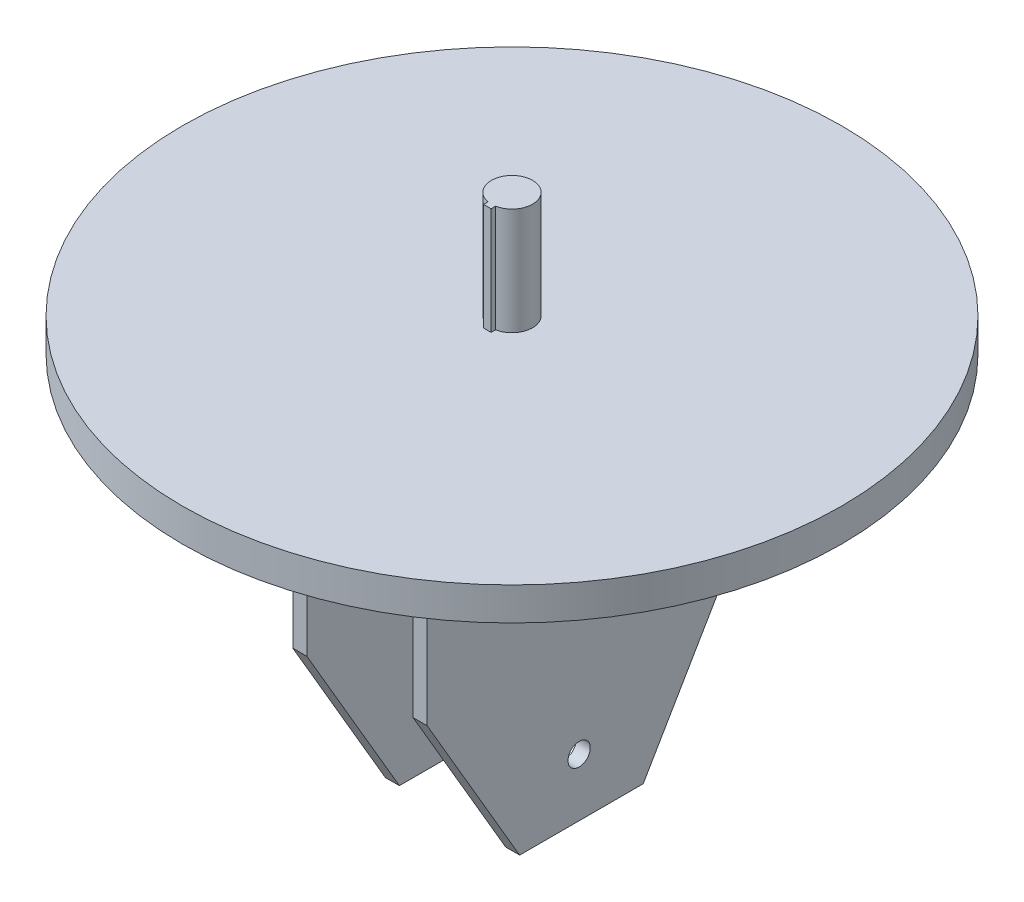
ISO-10303-21;
HEADER;
FILE_DESCRIPTION(('STEP AP214'),'2;1');
FILE_NAME('part.step','',(''),(''),'','','');
FILE_SCHEMA(('AUTOMOTIVE_DESIGN { 1 0 10303 214 1 1 1 1 }'));
ENDSEC;
DATA;
#1=APPLICATION_CONTEXT('core data for automotive mechanical design processes');
#2=APPLICATION_PROTOCOL_DEFINITION('international standard','automotive_design',2000,#1);
#3=PRODUCT_CONTEXT('',#1,'mechanical');
#4=PRODUCT('Part','Part','',(#3));
#5=PRODUCT_RELATED_PRODUCT_CATEGORY('part','',(#4));
#6=PRODUCT_DEFINITION_FORMATION('','',#4);
#7=PRODUCT_DEFINITION_CONTEXT('part definition',#1,'design');
#8=PRODUCT_DEFINITION('design','',#6,#7);
#9=PRODUCT_DEFINITION_SHAPE('','',#8);
#10=(LENGTH_UNIT() NAMED_UNIT(*) SI_UNIT(.MILLI.,.METRE.));
#11=(NAMED_UNIT(*) PLANE_ANGLE_UNIT() SI_UNIT($,.RADIAN.));
#12=(NAMED_UNIT(*) SI_UNIT($,.STERADIAN.) SOLID_ANGLE_UNIT());
#13=UNCERTAINTY_MEASURE_WITH_UNIT(LENGTH_MEASURE(1.E-05),#10,'distance_accuracy_value','');
#14=(GEOMETRIC_REPRESENTATION_CONTEXT(3) GLOBAL_UNCERTAINTY_ASSIGNED_CONTEXT((#13)) GLOBAL_UNIT_ASSIGNED_CONTEXT((#10,
#11,#12)) REPRESENTATION_CONTEXT('',''));
#15=CARTESIAN_POINT('',(0.,0.,0.));
#16=DIRECTION('',(0.,0.,1.));
#17=DIRECTION('',(1.,0.,0.));
#18=AXIS2_PLACEMENT_3D('',#15,#16,#17);
#19=CARTESIAN_POINT('',(81.5,-480.,184.555898069512));
#20=DIRECTION('',(-1.,0.,0.));
#21=DIRECTION('',(0.,0.,1.));
#22=AXIS2_PLACEMENT_3D('',#19,#20,#21);
#23=PLANE('',#22);
#24=CARTESIAN_POINT('',(81.5,-410.,0.));
#25=DIRECTION('',(-1.,0.,0.));
#26=DIRECTION('',(0.,0.,1.));
#27=AXIS2_PLACEMENT_3D('',#24,#25,#26);
#28=CIRCLE('',#27,13.5);
#29=CARTESIAN_POINT('',(81.5,-410.,13.5));
#30=VERTEX_POINT('',#29);
#31=EDGE_CURVE('E167',#30,#30,#28,.T.);
#32=ORIENTED_EDGE('',*,*,#31,.T.);
#33=EDGE_LOOP('',(#32));
#34=FACE_BOUND('',#33,.T.);
#35=DIRECTION('',(0.,0.863366102547364,0.504578014753096));
#36=VECTOR('',#35,1.);
#37=CARTESIAN_POINT('',(81.5,-431.058584485257,100.813923725285));
#38=LINE('',#37,#36);
#39=CARTESIAN_POINT('',(81.5,-480.,72.2110376416492));
#40=VERTEX_POINT('',#39);
#41=CARTESIAN_POINT('',(81.5,-287.770569757595,184.555898069512));
#42=VERTEX_POINT('',#41);
#43=EDGE_CURVE('E315',#40,#42,#38,.T.);
#44=ORIENTED_EDGE('',*,*,#43,.F.);
#45=DIRECTION('',(0.,0.,1.));
#46=VECTOR('',#45,1.);
#47=CARTESIAN_POINT('',(81.5,-480.,184.555898069512));
#48=LINE('',#47,#46);
#49=CARTESIAN_POINT('',(81.5,-480.,-77.7889623583508));
#50=VERTEX_POINT('',#49);
#51=EDGE_CURVE('E176',#50,#40,#48,.T.);
#52=ORIENTED_EDGE('',*,*,#51,.F.);
#53=DIRECTION('',(0.,-0.863366102547364,0.504578014753096));
#54=VECTOR('',#53,1.);
#55=CARTESIAN_POINT('',(81.5,-594.286748619013,-10.9962303288882));
#56=LINE('',#55,#54);
#57=CARTESIAN_POINT('',(81.5,-287.770569757595,-190.133822786214));
#58=VERTEX_POINT('',#57);
#59=EDGE_CURVE('E70',#58,#50,#56,.T.);
#60=ORIENTED_EDGE('',*,*,#59,.F.);
#61=DIRECTION('',(0.,1.,0.));
#62=VECTOR('',#61,1.);
#63=CARTESIAN_POINT('',(81.5,-480.,-190.133822786213));
#64=LINE('',#63,#62);
#65=CARTESIAN_POINT('',(81.5,-30.,-190.133822786213));
#66=VERTEX_POINT('',#65);
#67=EDGE_CURVE('E173',#58,#66,#64,.T.);
#68=ORIENTED_EDGE('',*,*,#67,.T.);
#69=DIRECTION('',(0.,0.,1.));
#70=VECTOR('',#69,1.);
#71=CARTESIAN_POINT('',(81.5,-30.,184.555898069512));
#72=LINE('',#71,#70);
#73=CARTESIAN_POINT('',(81.5,-30.,184.555898069512));
#74=VERTEX_POINT('',#73);
#75=EDGE_CURVE('E206',#66,#74,#72,.T.);
#76=ORIENTED_EDGE('',*,*,#75,.T.);
#77=DIRECTION('',(0.,1.,0.));
#78=VECTOR('',#77,1.);
#79=CARTESIAN_POINT('',(81.5,-480.,184.555898069512));
#80=LINE('',#79,#78);
#81=EDGE_CURVE('E313',#42,#74,#80,.T.);
#82=ORIENTED_EDGE('',*,*,#81,.F.);
#83=EDGE_LOOP('',(#44,#52,#60,#68,#76,#82));
#84=FACE_BOUND('',#83,.T.);
#85=ADVANCED_FACE('F45',(#34,#84),#23,.F.);
#86=CARTESIAN_POINT('',(81.5,-480.,184.555898069512));
#87=DIRECTION('',(0.,0.,-1.));
#88=DIRECTION('',(-1.,0.,0.));
#89=AXIS2_PLACEMENT_3D('',#86,#87,#88);
#90=PLANE('',#89);
#91=DIRECTION('',(-1.,0.,0.));
#92=VECTOR('',#91,1.);
#93=CARTESIAN_POINT('',(400.,-287.770569757595,184.555898069512));
#94=LINE('',#93,#92);
#95=CARTESIAN_POINT('',(64.5,-287.770569757595,184.555898069512));
#96=VERTEX_POINT('',#95);
#97=EDGE_CURVE('E330',#42,#96,#94,.T.);
#98=ORIENTED_EDGE('',*,*,#97,.F.);
#99=ORIENTED_EDGE('',*,*,#81,.T.);
#100=DIRECTION('',(-1.,0.,0.));
#101=VECTOR('',#100,1.);
#102=CARTESIAN_POINT('',(81.5,-30.,184.555898069512));
#103=LINE('',#102,#101);
#104=CARTESIAN_POINT('',(64.5,-30.,184.555898069512));
#105=VERTEX_POINT('',#104);
#106=EDGE_CURVE('E202',#74,#105,#103,.T.);
#107=ORIENTED_EDGE('',*,*,#106,.T.);
#108=DIRECTION('',(0.,1.,0.));
#109=VECTOR('',#108,1.);
#110=CARTESIAN_POINT('',(64.5,-480.,184.555898069512));
#111=LINE('',#110,#109);
#112=EDGE_CURVE('E192',#96,#105,#111,.T.);
#113=ORIENTED_EDGE('',*,*,#112,.F.);
#114=EDGE_LOOP('',(#98,#99,#107,#113));
#115=FACE_BOUND('',#114,.T.);
#116=ADVANCED_FACE('F328',(#115),#90,.F.);
#117=CARTESIAN_POINT('',(64.5,-480.,184.555898069512));
#118=DIRECTION('',(1.,0.,0.));
#119=DIRECTION('',(0.,0.,-1.));
#120=AXIS2_PLACEMENT_3D('',#117,#118,#119);
#121=PLANE('',#120);
#122=CARTESIAN_POINT('',(64.5,-410.,0.));
#123=DIRECTION('',(1.,0.,0.));
#124=DIRECTION('',(0.,0.,-1.));
#125=AXIS2_PLACEMENT_3D('',#122,#123,#124);
#126=CIRCLE('',#125,13.5);
#127=CARTESIAN_POINT('',(64.5,-410.,-13.5));
#128=VERTEX_POINT('',#127);
#129=EDGE_CURVE('E364',#128,#128,#126,.T.);
#130=ORIENTED_EDGE('',*,*,#129,.T.);
#131=EDGE_LOOP('',(#130));
#132=FACE_BOUND('',#131,.T.);
#133=DIRECTION('',(0.,-0.863366102547364,-0.504578014753096));
#134=VECTOR('',#133,1.);
#135=CARTESIAN_POINT('',(64.5,-431.058584485257,100.813923725285));
#136=LINE('',#135,#134);
#137=CARTESIAN_POINT('',(64.5,-480.,72.2110376416492));
#138=VERTEX_POINT('',#137);
#139=EDGE_CURVE('E62',#96,#138,#136,.T.);
#140=ORIENTED_EDGE('',*,*,#139,.F.);
#141=ORIENTED_EDGE('',*,*,#112,.T.);
#142=DIRECTION('',(0.,0.,-1.));
#143=VECTOR('',#142,1.);
#144=CARTESIAN_POINT('',(64.5,-30.,184.555898069512));
#145=LINE('',#144,#143);
#146=CARTESIAN_POINT('',(64.5,-30.,-190.133822786213));
#147=VERTEX_POINT('',#146);
#148=EDGE_CURVE('E198',#105,#147,#145,.T.);
#149=ORIENTED_EDGE('',*,*,#148,.T.);
#150=DIRECTION('',(0.,1.,0.));
#151=VECTOR('',#150,1.);
#152=CARTESIAN_POINT('',(64.5,-480.,-190.133822786213));
#153=LINE('',#152,#151);
#154=CARTESIAN_POINT('',(64.5000000000001,-287.770569757595,-190.133822786214));
#155=VERTEX_POINT('',#154);
#156=EDGE_CURVE('E186',#155,#147,#153,.T.);
#157=ORIENTED_EDGE('',*,*,#156,.F.);
#158=DIRECTION('',(0.,0.863366102547364,-0.504578014753096));
#159=VECTOR('',#158,1.);
#160=CARTESIAN_POINT('',(64.5,-594.286748619013,-10.9962303288882));
#161=LINE('',#160,#159);
#162=CARTESIAN_POINT('',(64.5,-480.,-77.7889623583508));
#163=VERTEX_POINT('',#162);
#164=EDGE_CURVE('E161',#163,#155,#161,.T.);
#165=ORIENTED_EDGE('',*,*,#164,.F.);
#166=DIRECTION('',(0.,0.,-1.));
#167=VECTOR('',#166,1.);
#168=CARTESIAN_POINT('',(64.5,-480.,184.555898069512));
#169=LINE('',#168,#167);
#170=EDGE_CURVE('E185',#138,#163,#169,.T.);
#171=ORIENTED_EDGE('',*,*,#170,.F.);
#172=EDGE_LOOP('',(#140,#141,#149,#157,#165,#171));
#173=FACE_BOUND('',#172,.T.);
#174=ADVANCED_FACE('F320',(#132,#173),#121,.F.);
#175=CARTESIAN_POINT('',(81.5,-480.,-190.133822786213));
#176=DIRECTION('',(0.,0.,1.));
#177=DIRECTION('',(1.,0.,0.));
#178=AXIS2_PLACEMENT_3D('',#175,#176,#177);
#179=PLANE('',#178);
#180=DIRECTION('',(-1.,0.,0.));
#181=VECTOR('',#180,1.);
#182=CARTESIAN_POINT('',(400.,-287.770569757595,-190.133822786214));
#183=LINE('',#182,#181);
#184=EDGE_CURVE('E158',#58,#155,#183,.T.);
#185=ORIENTED_EDGE('',*,*,#184,.T.);
#186=ORIENTED_EDGE('',*,*,#156,.T.);
#187=DIRECTION('',(1.,0.,0.));
#188=VECTOR('',#187,1.);
#189=CARTESIAN_POINT('',(81.5,-30.,-190.133822786213));
#190=LINE('',#189,#188);
#191=EDGE_CURVE('E183',#147,#66,#190,.T.);
#192=ORIENTED_EDGE('',*,*,#191,.T.);
#193=ORIENTED_EDGE('',*,*,#67,.F.);
#194=EDGE_LOOP('',(#185,#186,#192,#193));
#195=FACE_BOUND('',#194,.T.);
#196=ADVANCED_FACE('F181',(#195),#179,.F.);
#197=CARTESIAN_POINT('',(0.,-480.,0.));
#198=DIRECTION('',(0.,1.,0.));
#199=DIRECTION('',(0.,0.,1.));
#200=AXIS2_PLACEMENT_3D('',#197,#198,#199);
#201=PLANE('',#200);
#202=DIRECTION('',(-1.,0.,0.));
#203=VECTOR('',#202,1.);
#204=CARTESIAN_POINT('',(400.,-480.,72.2110376416492));
#205=LINE('',#204,#203);
#206=EDGE_CURVE('E334',#40,#138,#205,.T.);
#207=ORIENTED_EDGE('',*,*,#206,.T.);
#208=ORIENTED_EDGE('',*,*,#170,.T.);
#209=DIRECTION('',(-1.,0.,0.));
#210=VECTOR('',#209,1.);
#211=CARTESIAN_POINT('',(400.,-480.,-77.7889623583508));
#212=LINE('',#211,#210);
#213=EDGE_CURVE('E166',#50,#163,#212,.T.);
#214=ORIENTED_EDGE('',*,*,#213,.F.);
#215=ORIENTED_EDGE('',*,*,#51,.T.);
#216=EDGE_LOOP('',(#207,#208,#214,#215));
#217=FACE_BOUND('',#216,.T.);
#218=ADVANCED_FACE('F333',(#217),#201,.F.);
#219=CARTESIAN_POINT('',(-81.5,-480.,184.555898069512));
#220=DIRECTION('',(1.,0.,0.));
#221=DIRECTION('',(0.,0.,-1.));
#222=AXIS2_PLACEMENT_3D('',#219,#220,#221);
#223=PLANE('',#222);
#224=CARTESIAN_POINT('',(-81.5,-410.,0.));
#225=DIRECTION('',(-1.,0.,0.));
#226=DIRECTION('',(0.,0.,1.));
#227=AXIS2_PLACEMENT_3D('',#224,#225,#226);
#228=CIRCLE('',#227,13.5);
#229=CARTESIAN_POINT('',(-81.5,-410.,13.5));
#230=VERTEX_POINT('',#229);
#231=EDGE_CURVE('E368',#230,#230,#228,.T.);
#232=ORIENTED_EDGE('',*,*,#231,.F.);
#233=EDGE_LOOP('',(#232));
#234=FACE_BOUND('',#233,.T.);
#235=DIRECTION('',(0.,-0.863366102547364,-0.504578014753096));
#236=VECTOR('',#235,1.);
#237=CARTESIAN_POINT('',(-81.5,-431.058584485257,100.813923725285));
#238=LINE('',#237,#236);
#239=CARTESIAN_POINT('',(-81.5,-287.770569757595,184.555898069512));
#240=VERTEX_POINT('',#239);
#241=CARTESIAN_POINT('',(-81.5,-480.,72.2110376416492));
#242=VERTEX_POINT('',#241);
#243=EDGE_CURVE('E354',#240,#242,#238,.T.);
#244=ORIENTED_EDGE('',*,*,#243,.F.);
#245=DIRECTION('',(0.,1.,0.));
#246=VECTOR('',#245,1.);
#247=CARTESIAN_POINT('',(-81.5,-480.,184.555898069512));
#248=LINE('',#247,#246);
#249=CARTESIAN_POINT('',(-81.5,-30.,184.555898069512));
#250=VERTEX_POINT('',#249);
#251=EDGE_CURVE('E282',#240,#250,#248,.T.);
#252=ORIENTED_EDGE('',*,*,#251,.T.);
#253=DIRECTION('',(0.,0.,-1.));
#254=VECTOR('',#253,1.);
#255=CARTESIAN_POINT('',(-81.5,-30.,184.555898069512));
#256=LINE('',#255,#254);
#257=CARTESIAN_POINT('',(-81.5,-30.,-184.646734823892));
#258=VERTEX_POINT('',#257);
#259=EDGE_CURVE('E208',#250,#258,#256,.T.);
#260=ORIENTED_EDGE('',*,*,#259,.T.);
#261=DIRECTION('',(0.,1.,0.));
#262=VECTOR('',#261,1.);
#263=CARTESIAN_POINT('',(-81.5,-480.,-184.646734823892));
#264=LINE('',#263,#262);
#265=CARTESIAN_POINT('',(-81.5,-297.159337420575,-184.646734823892));
#266=VERTEX_POINT('',#265);
#267=EDGE_CURVE('E217',#266,#258,#264,.T.);
#268=ORIENTED_EDGE('',*,*,#267,.F.);
#269=DIRECTION('',(0.,0.863366102547364,-0.504578014753096));
#270=VECTOR('',#269,1.);
#271=CARTESIAN_POINT('',(-81.5,-594.286748619013,-10.9962303288883));
#272=LINE('',#271,#270);
#273=CARTESIAN_POINT('',(-81.5,-480.,-77.7889623583509));
#274=VERTEX_POINT('',#273);
#275=EDGE_CURVE('E347',#274,#266,#272,.T.);
#276=ORIENTED_EDGE('',*,*,#275,.F.);
#277=DIRECTION('',(0.,0.,-1.));
#278=VECTOR('',#277,1.);
#279=CARTESIAN_POINT('',(-81.5,-480.,184.555898069512));
#280=LINE('',#279,#278);
#281=EDGE_CURVE('E271',#242,#274,#280,.T.);
#282=ORIENTED_EDGE('',*,*,#281,.F.);
#283=EDGE_LOOP('',(#244,#252,#260,#268,#276,#282));
#284=FACE_BOUND('',#283,.T.);
#285=ADVANCED_FACE('F400',(#234,#284),#223,.F.);
#286=CARTESIAN_POINT('',(-81.5,-480.,-184.646734823892));
#287=DIRECTION('',(0.,0.,1.));
#288=DIRECTION('',(1.,0.,0.));
#289=AXIS2_PLACEMENT_3D('',#286,#287,#288);
#290=PLANE('',#289);
#291=DIRECTION('',(1.,0.,0.));
#292=VECTOR('',#291,1.);
#293=CARTESIAN_POINT('',(-81.5,-297.159337420575,-184.646734823892));
#294=LINE('',#293,#292);
#295=CARTESIAN_POINT('',(-64.5,-297.159337420575,-184.646734823892));
#296=VERTEX_POINT('',#295);
#297=EDGE_CURVE('E344',#266,#296,#294,.T.);
#298=ORIENTED_EDGE('',*,*,#297,.F.);
#299=ORIENTED_EDGE('',*,*,#267,.T.);
#300=DIRECTION('',(1.,0.,0.));
#301=VECTOR('',#300,1.);
#302=CARTESIAN_POINT('',(-81.5,-30.,-184.646734823892));
#303=LINE('',#302,#301);
#304=CARTESIAN_POINT('',(-64.5,-30.,-184.646734823892));
#305=VERTEX_POINT('',#304);
#306=EDGE_CURVE('E295',#258,#305,#303,.T.);
#307=ORIENTED_EDGE('',*,*,#306,.T.);
#308=DIRECTION('',(0.,1.,0.));
#309=VECTOR('',#308,1.);
#310=CARTESIAN_POINT('',(-64.5,-480.,-184.646734823892));
#311=LINE('',#310,#309);
#312=EDGE_CURVE('E308',#296,#305,#311,.T.);
#313=ORIENTED_EDGE('',*,*,#312,.F.);
#314=EDGE_LOOP('',(#298,#299,#307,#313));
#315=FACE_BOUND('',#314,.T.);
#316=ADVANCED_FACE('F466',(#315),#290,.F.);
#317=CARTESIAN_POINT('',(-64.5,-480.,184.555898069512));
#318=DIRECTION('',(-1.,0.,0.));
#319=DIRECTION('',(0.,0.,1.));
#320=AXIS2_PLACEMENT_3D('',#317,#318,#319);
#321=PLANE('',#320);
#322=CARTESIAN_POINT('',(-64.5000000000001,-410.,0.));
#323=DIRECTION('',(-1.,0.,0.));
#324=DIRECTION('',(0.,0.,1.));
#325=AXIS2_PLACEMENT_3D('',#322,#323,#324);
#326=CIRCLE('',#325,13.5);
#327=CARTESIAN_POINT('',(-64.5000000000001,-410.,13.5));
#328=VERTEX_POINT('',#327);
#329=EDGE_CURVE('E49',#328,#328,#326,.T.);
#330=ORIENTED_EDGE('',*,*,#329,.T.);
#331=EDGE_LOOP('',(#330));
#332=FACE_BOUND('',#331,.T.);
#333=DIRECTION('',(0.,0.863366102547364,0.504578014753096));
#334=VECTOR('',#333,1.);
#335=CARTESIAN_POINT('',(-64.5,-431.058584485257,100.813923725285));
#336=LINE('',#335,#334);
#337=CARTESIAN_POINT('',(-64.5,-480.,72.2110376416492));
#338=VERTEX_POINT('',#337);
#339=CARTESIAN_POINT('',(-64.5,-287.770569757595,184.555898069512));
#340=VERTEX_POINT('',#339);
#341=EDGE_CURVE('E178',#338,#340,#336,.T.);
#342=ORIENTED_EDGE('',*,*,#341,.F.);
#343=DIRECTION('',(0.,0.,1.));
#344=VECTOR('',#343,1.);
#345=CARTESIAN_POINT('',(-64.5,-480.,184.555898069512));
#346=LINE('',#345,#344);
#347=CARTESIAN_POINT('',(-64.5,-480.,-77.7889623583508));
#348=VERTEX_POINT('',#347);
#349=EDGE_CURVE('E269',#348,#338,#346,.T.);
#350=ORIENTED_EDGE('',*,*,#349,.F.);
#351=DIRECTION('',(0.,-0.863366102547364,0.504578014753096));
#352=VECTOR('',#351,1.);
#353=CARTESIAN_POINT('',(-64.5,-594.286748619013,-10.9962303288883));
#354=LINE('',#353,#352);
#355=EDGE_CURVE('E278',#296,#348,#354,.T.);
#356=ORIENTED_EDGE('',*,*,#355,.F.);
#357=ORIENTED_EDGE('',*,*,#312,.T.);
#358=DIRECTION('',(0.,0.,1.));
#359=VECTOR('',#358,1.);
#360=CARTESIAN_POINT('',(-64.5,-30.,184.555898069512));
#361=LINE('',#360,#359);
#362=CARTESIAN_POINT('',(-64.5,-30.,184.555898069512));
#363=VERTEX_POINT('',#362);
#364=EDGE_CURVE('E299',#305,#363,#361,.T.);
#365=ORIENTED_EDGE('',*,*,#364,.T.);
#366=DIRECTION('',(0.,1.,0.));
#367=VECTOR('',#366,1.);
#368=CARTESIAN_POINT('',(-64.5,-480.,184.555898069512));
#369=LINE('',#368,#367);
#370=EDGE_CURVE('E286',#340,#363,#369,.T.);
#371=ORIENTED_EDGE('',*,*,#370,.F.);
#372=EDGE_LOOP('',(#342,#350,#356,#357,#365,#371));
#373=FACE_BOUND('',#372,.T.);
#374=ADVANCED_FACE('F277',(#332,#373),#321,.F.);
#375=CARTESIAN_POINT('',(-81.5,-480.,184.555898069512));
#376=DIRECTION('',(0.,0.,-1.));
#377=DIRECTION('',(-1.,0.,0.));
#378=AXIS2_PLACEMENT_3D('',#375,#376,#377);
#379=PLANE('',#378);
#380=EDGE_CURVE('E336',#340,#240,#94,.T.);
#381=ORIENTED_EDGE('',*,*,#380,.F.);
#382=ORIENTED_EDGE('',*,*,#370,.T.);
#383=DIRECTION('',(-1.,0.,0.));
#384=VECTOR('',#383,1.);
#385=CARTESIAN_POINT('',(-81.5,-30.,184.555898069512));
#386=LINE('',#385,#384);
#387=EDGE_CURVE('E288',#363,#250,#386,.T.);
#388=ORIENTED_EDGE('',*,*,#387,.T.);
#389=ORIENTED_EDGE('',*,*,#251,.F.);
#390=EDGE_LOOP('',(#381,#382,#388,#389));
#391=FACE_BOUND('',#390,.T.);
#392=ADVANCED_FACE('F463',(#391),#379,.F.);
#393=CARTESIAN_POINT('',(0.,-480.,0.));
#394=DIRECTION('',(0.,-1.,0.));
#395=DIRECTION('',(0.,0.,-1.));
#396=AXIS2_PLACEMENT_3D('',#393,#394,#395);
#397=PLANE('',#396);
#398=ORIENTED_EDGE('',*,*,#349,.T.);
#399=DIRECTION('',(-1.,0.,0.));
#400=VECTOR('',#399,1.);
#401=CARTESIAN_POINT('',(0.,-480.,72.2110376416492));
#402=LINE('',#401,#400);
#403=EDGE_CURVE('E11',#338,#242,#402,.T.);
#404=ORIENTED_EDGE('',*,*,#403,.T.);
#405=ORIENTED_EDGE('',*,*,#281,.T.);
#406=DIRECTION('',(1.,0.,0.));
#407=VECTOR('',#406,1.);
#408=CARTESIAN_POINT('',(0.,-480.,-77.7889623583509));
#409=LINE('',#408,#407);
#410=EDGE_CURVE('E55',#274,#348,#409,.T.);
#411=ORIENTED_EDGE('',*,*,#410,.T.);
#412=EDGE_LOOP('',(#398,#404,#405,#411));
#413=FACE_BOUND('',#412,.T.);
#414=ADVANCED_FACE('F268',(#413),#397,.T.);
#415=CARTESIAN_POINT('',(0.,-30.,0.));
#416=DIRECTION('',(0.,1.,0.));
#417=DIRECTION('',(0.,0.,1.));
#418=AXIS2_PLACEMENT_3D('',#415,#416,#417);
#419=PLANE('',#418);
#420=ORIENTED_EDGE('',*,*,#75,.F.);
#421=ORIENTED_EDGE('',*,*,#191,.F.);
#422=ORIENTED_EDGE('',*,*,#148,.F.);
#423=ORIENTED_EDGE('',*,*,#106,.F.);
#424=EDGE_LOOP('',(#420,#421,#422,#423));
#425=FACE_BOUND('',#424,.T.);
#426=CARTESIAN_POINT('',(0.,-30.,0.));
#427=DIRECTION('',(0.,1.,0.));
#428=DIRECTION('',(0.,0.,1.));
#429=AXIS2_PLACEMENT_3D('',#426,#427,#428);
#430=CIRCLE('',#429,400.);
#431=CARTESIAN_POINT('',(0.,-30.,400.));
#432=VERTEX_POINT('',#431);
#433=EDGE_CURVE('E212',#432,#432,#430,.T.);
#434=ORIENTED_EDGE('',*,*,#433,.F.);
#435=EDGE_LOOP('',(#434));
#436=FACE_BOUND('',#435,.T.);
#437=ORIENTED_EDGE('',*,*,#259,.F.);
#438=ORIENTED_EDGE('',*,*,#387,.F.);
#439=ORIENTED_EDGE('',*,*,#364,.F.);
#440=ORIENTED_EDGE('',*,*,#306,.F.);
#441=EDGE_LOOP('',(#437,#438,#439,#440));
#442=FACE_BOUND('',#441,.T.);
#443=ADVANCED_FACE('F326',(#425,#436,#442),#419,.F.);
#444=CARTESIAN_POINT('',(0.,10.,0.));
#445=DIRECTION('',(0.,1.,0.));
#446=DIRECTION('',(0.,0.,1.));
#447=AXIS2_PLACEMENT_3D('',#444,#445,#446);
#448=PLANE('',#447);
#449=CARTESIAN_POINT('',(0.,10.,0.));
#450=DIRECTION('',(0.,1.,0.));
#451=DIRECTION('',(0.,0.,1.));
#452=AXIS2_PLACEMENT_3D('',#449,#450,#451);
#453=CIRCLE('',#452,400.);
#454=CARTESIAN_POINT('',(0.,10.,400.));
#455=VERTEX_POINT('',#454);
#456=EDGE_CURVE('E258',#455,#455,#453,.T.);
#457=ORIENTED_EDGE('',*,*,#456,.T.);
#458=EDGE_LOOP('',(#457));
#459=FACE_BOUND('',#458,.T.);
#460=DIRECTION('',(0.,0.,1.));
#461=VECTOR('',#460,1.);
#462=CARTESIAN_POINT('',(-4.6,10.,30.015));
#463=LINE('',#462,#461);
#464=CARTESIAN_POINT('',(-4.6,10.,24.5731560854523));
#465=VERTEX_POINT('',#464);
#466=CARTESIAN_POINT('',(-4.6,10.,30.015));
#467=VERTEX_POINT('',#466);
#468=EDGE_CURVE('E236',#465,#467,#463,.T.);
#469=ORIENTED_EDGE('',*,*,#468,.F.);
#470=CARTESIAN_POINT('',(0.,10.,0.));
#471=DIRECTION('',(0.,1.,0.));
#472=DIRECTION('',(0.,0.,1.));
#473=AXIS2_PLACEMENT_3D('',#470,#471,#472);
#474=CIRCLE('',#473,25.);
#475=CARTESIAN_POINT('',(4.6,10.,24.5731560854523));
#476=VERTEX_POINT('',#475);
#477=EDGE_CURVE('E216',#476,#465,#474,.T.);
#478=ORIENTED_EDGE('',*,*,#477,.F.);
#479=DIRECTION('',(0.,0.,-1.));
#480=VECTOR('',#479,1.);
#481=CARTESIAN_POINT('',(4.6,10.,30.015));
#482=LINE('',#481,#480);
#483=CARTESIAN_POINT('',(4.6,10.,30.015));
#484=VERTEX_POINT('',#483);
#485=EDGE_CURVE('E223',#484,#476,#482,.T.);
#486=ORIENTED_EDGE('',*,*,#485,.F.);
#487=DIRECTION('',(1.,0.,0.));
#488=VECTOR('',#487,1.);
#489=CARTESIAN_POINT('',(-4.6,10.,30.015));
#490=LINE('',#489,#488);
#491=EDGE_CURVE('E239',#467,#484,#490,.T.);
#492=ORIENTED_EDGE('',*,*,#491,.F.);
#493=EDGE_LOOP('',(#469,#478,#486,#492));
#494=FACE_BOUND('',#493,.T.);
#495=ADVANCED_FACE('F411',(#459,#494),#448,.T.);
#496=CARTESIAN_POINT('',(0.,10.,0.));
#497=DIRECTION('',(0.,-1.,0.));
#498=DIRECTION('',(0.,0.,-1.));
#499=AXIS2_PLACEMENT_3D('',#496,#497,#498);
#500=CYLINDRICAL_SURFACE('',#499,400.);
#501=ORIENTED_EDGE('',*,*,#456,.F.);
#502=EDGE_LOOP('',(#501));
#503=FACE_BOUND('',#502,.T.);
#504=ORIENTED_EDGE('',*,*,#433,.T.);
#505=EDGE_LOOP('',(#504));
#506=FACE_BOUND('',#505,.T.);
#507=ADVANCED_FACE('F47',(#503,#506),#500,.T.);
#508=CARTESIAN_POINT('',(0.,140.,0.));
#509=DIRECTION('',(0.,-1.,0.));
#510=DIRECTION('',(0.,0.,-1.));
#511=AXIS2_PLACEMENT_3D('',#508,#509,#510);
#512=CYLINDRICAL_SURFACE('',#511,25.);
#513=ORIENTED_EDGE('',*,*,#477,.T.);
#514=DIRECTION('',(0.,-1.,0.));
#515=VECTOR('',#514,1.);
#516=CARTESIAN_POINT('',(-4.6,140.,24.5731560854523));
#517=LINE('',#516,#515);
#518=CARTESIAN_POINT('',(-4.6,140.,24.5731560854523));
#519=VERTEX_POINT('',#518);
#520=EDGE_CURVE('E255',#519,#465,#517,.T.);
#521=ORIENTED_EDGE('',*,*,#520,.F.);
#522=CARTESIAN_POINT('',(0.,140.,0.));
#523=DIRECTION('',(0.,1.,0.));
#524=DIRECTION('',(0.,0.,1.));
#525=AXIS2_PLACEMENT_3D('',#522,#523,#524);
#526=CIRCLE('',#525,25.);
#527=CARTESIAN_POINT('',(4.6,140.,24.5731560854523));
#528=VERTEX_POINT('',#527);
#529=EDGE_CURVE('E218',#528,#519,#526,.T.);
#530=ORIENTED_EDGE('',*,*,#529,.F.);
#531=DIRECTION('',(0.,-1.,0.));
#532=VECTOR('',#531,1.);
#533=CARTESIAN_POINT('',(4.6,140.,24.5731560854523));
#534=LINE('',#533,#532);
#535=EDGE_CURVE('E232',#528,#476,#534,.T.);
#536=ORIENTED_EDGE('',*,*,#535,.T.);
#537=EDGE_LOOP('',(#513,#521,#530,#536));
#538=FACE_BOUND('',#537,.T.);
#539=ADVANCED_FACE('F428',(#538),#512,.T.);
#540=CARTESIAN_POINT('',(-4.6,140.,30.015));
#541=DIRECTION('',(1.,0.,0.));
#542=DIRECTION('',(0.,0.,-1.));
#543=AXIS2_PLACEMENT_3D('',#540,#541,#542);
#544=PLANE('',#543);
#545=ORIENTED_EDGE('',*,*,#468,.T.);
#546=DIRECTION('',(0.,-1.,0.));
#547=VECTOR('',#546,1.);
#548=CARTESIAN_POINT('',(-4.6,140.,30.015));
#549=LINE('',#548,#547);
#550=CARTESIAN_POINT('',(-4.6,140.,30.015));
#551=VERTEX_POINT('',#550);
#552=EDGE_CURVE('E251',#551,#467,#549,.T.);
#553=ORIENTED_EDGE('',*,*,#552,.F.);
#554=DIRECTION('',(0.,0.,1.));
#555=VECTOR('',#554,1.);
#556=CARTESIAN_POINT('',(-4.6,140.,30.015));
#557=LINE('',#556,#555);
#558=EDGE_CURVE('E222',#519,#551,#557,.T.);
#559=ORIENTED_EDGE('',*,*,#558,.F.);
#560=ORIENTED_EDGE('',*,*,#520,.T.);
#561=EDGE_LOOP('',(#545,#553,#559,#560));
#562=FACE_BOUND('',#561,.T.);
#563=ADVANCED_FACE('F424',(#562),#544,.F.);
#564=CARTESIAN_POINT('',(-4.6,140.,30.015));
#565=DIRECTION('',(0.,0.,-1.));
#566=DIRECTION('',(-1.,0.,0.));
#567=AXIS2_PLACEMENT_3D('',#564,#565,#566);
#568=PLANE('',#567);
#569=ORIENTED_EDGE('',*,*,#491,.T.);
#570=DIRECTION('',(0.,-1.,0.));
#571=VECTOR('',#570,1.);
#572=CARTESIAN_POINT('',(4.6,140.,30.015));
#573=LINE('',#572,#571);
#574=CARTESIAN_POINT('',(4.6,140.,30.015));
#575=VERTEX_POINT('',#574);
#576=EDGE_CURVE('E248',#575,#484,#573,.T.);
#577=ORIENTED_EDGE('',*,*,#576,.F.);
#578=DIRECTION('',(1.,0.,0.));
#579=VECTOR('',#578,1.);
#580=CARTESIAN_POINT('',(-4.6,140.,30.015));
#581=LINE('',#580,#579);
#582=EDGE_CURVE('E226',#551,#575,#581,.T.);
#583=ORIENTED_EDGE('',*,*,#582,.F.);
#584=ORIENTED_EDGE('',*,*,#552,.T.);
#585=EDGE_LOOP('',(#569,#577,#583,#584));
#586=FACE_BOUND('',#585,.T.);
#587=ADVANCED_FACE('F420',(#586),#568,.F.);
#588=CARTESIAN_POINT('',(4.6,140.,30.015));
#589=DIRECTION('',(-1.,0.,0.));
#590=DIRECTION('',(0.,0.,1.));
#591=AXIS2_PLACEMENT_3D('',#588,#589,#590);
#592=PLANE('',#591);
#593=ORIENTED_EDGE('',*,*,#485,.T.);
#594=ORIENTED_EDGE('',*,*,#535,.F.);
#595=DIRECTION('',(0.,0.,-1.));
#596=VECTOR('',#595,1.);
#597=CARTESIAN_POINT('',(4.6,140.,30.015));
#598=LINE('',#597,#596);
#599=EDGE_CURVE('E229',#575,#528,#598,.T.);
#600=ORIENTED_EDGE('',*,*,#599,.F.);
#601=ORIENTED_EDGE('',*,*,#576,.T.);
#602=EDGE_LOOP('',(#593,#594,#600,#601));
#603=FACE_BOUND('',#602,.T.);
#604=ADVANCED_FACE('F416',(#603),#592,.F.);
#605=CARTESIAN_POINT('',(0.,140.,0.));
#606=DIRECTION('',(0.,1.,0.));
#607=DIRECTION('',(0.,0.,1.));
#608=AXIS2_PLACEMENT_3D('',#605,#606,#607);
#609=PLANE('',#608);
#610=ORIENTED_EDGE('',*,*,#529,.T.);
#611=ORIENTED_EDGE('',*,*,#558,.T.);
#612=ORIENTED_EDGE('',*,*,#582,.T.);
#613=ORIENTED_EDGE('',*,*,#599,.T.);
#614=EDGE_LOOP('',(#610,#611,#612,#613));
#615=FACE_BOUND('',#614,.T.);
#616=ADVANCED_FACE('F412',(#615),#609,.T.);
#617=CARTESIAN_POINT('',(400.,-480.,-77.7889623583508));
#618=DIRECTION('',(0.,-0.504578014753096,-0.863366102547364));
#619=DIRECTION('',(0.,0.863366102547364,-0.504578014753096));
#620=AXIS2_PLACEMENT_3D('',#617,#618,#619);
#621=PLANE('',#620);
#622=ORIENTED_EDGE('',*,*,#275,.T.);
#623=ORIENTED_EDGE('',*,*,#297,.T.);
#624=ORIENTED_EDGE('',*,*,#355,.T.);
#625=ORIENTED_EDGE('',*,*,#410,.F.);
#626=EDGE_LOOP('',(#622,#623,#624,#625));
#627=FACE_BOUND('',#626,.T.);
#628=ADVANCED_FACE('F415',(#627),#621,.T.);
#629=CARTESIAN_POINT('',(400.,-287.770569757595,184.555898069512));
#630=DIRECTION('',(0.,-0.504578014753096,0.863366102547364));
#631=DIRECTION('',(0.,-0.863366102547364,-0.504578014753096));
#632=AXIS2_PLACEMENT_3D('',#629,#630,#631);
#633=PLANE('',#632);
#634=ORIENTED_EDGE('',*,*,#243,.T.);
#635=ORIENTED_EDGE('',*,*,#403,.F.);
#636=ORIENTED_EDGE('',*,*,#341,.T.);
#637=ORIENTED_EDGE('',*,*,#380,.T.);
#638=EDGE_LOOP('',(#634,#635,#636,#637));
#639=FACE_BOUND('',#638,.T.);
#640=ADVANCED_FACE('F390',(#639),#633,.T.);
#641=ORIENTED_EDGE('',*,*,#59,.T.);
#642=ORIENTED_EDGE('',*,*,#213,.T.);
#643=ORIENTED_EDGE('',*,*,#164,.T.);
#644=ORIENTED_EDGE('',*,*,#184,.F.);
#645=EDGE_LOOP('',(#641,#642,#643,#644));
#646=FACE_BOUND('',#645,.T.);
#647=ADVANCED_FACE('F159',(#646),#621,.T.);
#648=ORIENTED_EDGE('',*,*,#43,.T.);
#649=ORIENTED_EDGE('',*,*,#97,.T.);
#650=ORIENTED_EDGE('',*,*,#139,.T.);
#651=ORIENTED_EDGE('',*,*,#206,.F.);
#652=EDGE_LOOP('',(#648,#649,#650,#651));
#653=FACE_BOUND('',#652,.T.);
#654=ADVANCED_FACE('F381',(#653),#633,.T.);
#655=CARTESIAN_POINT('',(218.5,-410.,0.));
#656=DIRECTION('',(-1.,0.,0.));
#657=DIRECTION('',(0.,0.,1.));
#658=AXIS2_PLACEMENT_3D('',#655,#656,#657);
#659=CYLINDRICAL_SURFACE('',#658,13.5);
#660=ORIENTED_EDGE('',*,*,#231,.T.);
#661=EDGE_LOOP('',(#660));
#662=FACE_BOUND('',#661,.T.);
#663=ORIENTED_EDGE('',*,*,#329,.F.);
#664=EDGE_LOOP('',(#663));
#665=FACE_BOUND('',#664,.T.);
#666=ADVANCED_FACE('F378',(#662,#665),#659,.F.);
#667=ORIENTED_EDGE('',*,*,#129,.F.);
#668=EDGE_LOOP('',(#667));
#669=FACE_BOUND('',#668,.T.);
#670=ORIENTED_EDGE('',*,*,#31,.F.);
#671=EDGE_LOOP('',(#670));
#672=FACE_BOUND('',#671,.T.);
#673=ADVANCED_FACE('F380',(#669,#672),#659,.F.);
#674=CLOSED_SHELL('',(#85,#116,#174,#196,#218,#285,#316,#374,#392,#414,#443,#495,#507,#539,#563,
#587,#604,#616,#628,#640,#647,#654,#666,#673));
#675=MANIFOLD_SOLID_BREP('B2',#674);
#676=ADVANCED_BREP_SHAPE_REPRESENTATION('',(#18,#675),#14);
#677=SHAPE_DEFINITION_REPRESENTATION(#9,#676);
ENDSEC;
END-ISO-10303-21;
